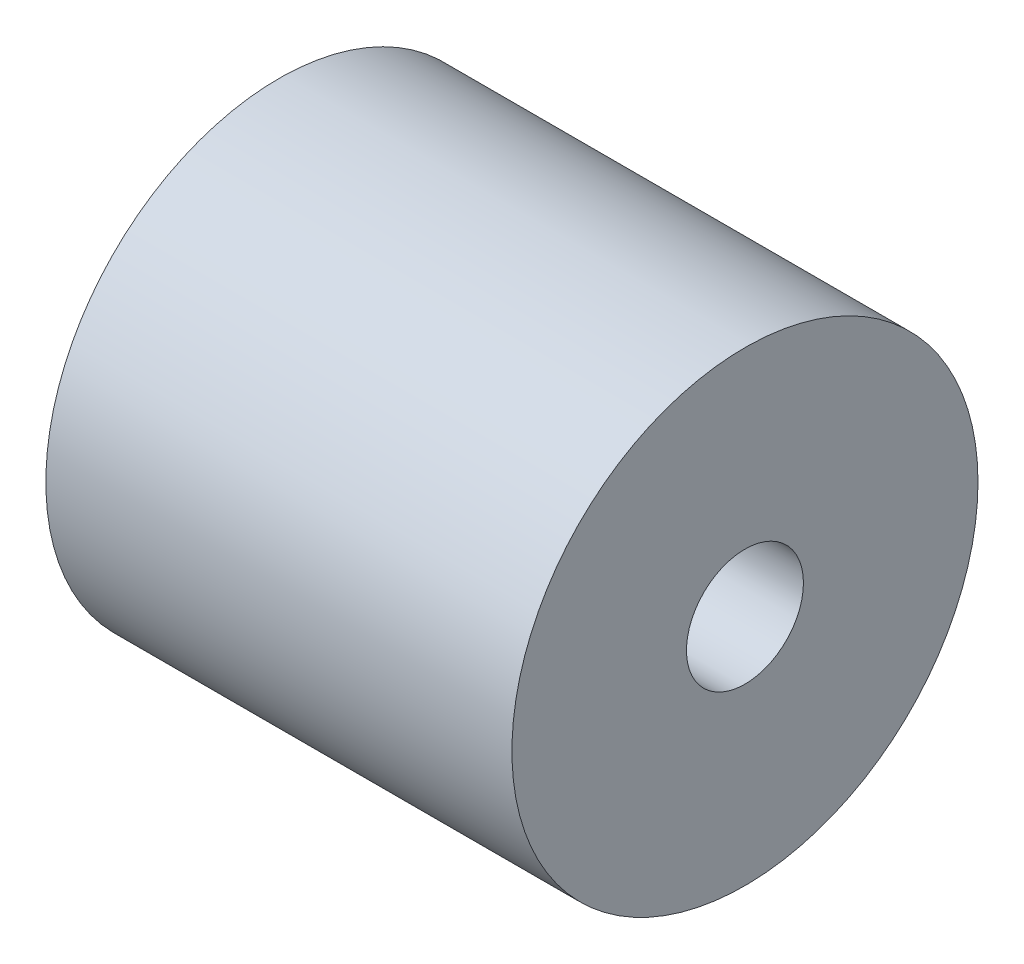
ISO-10303-21;
HEADER;
FILE_DESCRIPTION(('STEP AP214'),'2;1');
FILE_NAME('part.step','',(''),(''),'','','');
FILE_SCHEMA(('AUTOMOTIVE_DESIGN { 1 0 10303 214 1 1 1 1 }'));
ENDSEC;
DATA;
#1=APPLICATION_CONTEXT('core data for automotive mechanical design processes');
#2=APPLICATION_PROTOCOL_DEFINITION('international standard','automotive_design',2000,#1);
#3=PRODUCT_CONTEXT('',#1,'mechanical');
#4=PRODUCT('Part','Part','',(#3));
#5=PRODUCT_RELATED_PRODUCT_CATEGORY('part','',(#4));
#6=PRODUCT_DEFINITION_FORMATION('','',#4);
#7=PRODUCT_DEFINITION_CONTEXT('part definition',#1,'design');
#8=PRODUCT_DEFINITION('design','',#6,#7);
#9=PRODUCT_DEFINITION_SHAPE('','',#8);
#10=(LENGTH_UNIT() NAMED_UNIT(*) SI_UNIT(.MILLI.,.METRE.));
#11=(NAMED_UNIT(*) PLANE_ANGLE_UNIT() SI_UNIT($,.RADIAN.));
#12=(NAMED_UNIT(*) SI_UNIT($,.STERADIAN.) SOLID_ANGLE_UNIT());
#13=UNCERTAINTY_MEASURE_WITH_UNIT(LENGTH_MEASURE(1.E-05),#10,'distance_accuracy_value','');
#14=(GEOMETRIC_REPRESENTATION_CONTEXT(3) GLOBAL_UNCERTAINTY_ASSIGNED_CONTEXT((#13)) GLOBAL_UNIT_ASSIGNED_CONTEXT((#10,
#11,#12)) REPRESENTATION_CONTEXT('',''));
#15=CARTESIAN_POINT('',(0.,0.,0.));
#16=DIRECTION('',(0.,0.,1.));
#17=DIRECTION('',(1.,0.,0.));
#18=AXIS2_PLACEMENT_3D('',#15,#16,#17);
#19=CARTESIAN_POINT('',(203.2,0.,0.));
#20=DIRECTION('',(1.,0.,0.));
#21=DIRECTION('',(0.,0.,-1.));
#22=AXIS2_PLACEMENT_3D('',#19,#20,#21);
#23=PLANE('',#22);
#24=CARTESIAN_POINT('',(203.2,0.,0.));
#25=DIRECTION('',(1.,0.,0.));
#26=DIRECTION('',(0.,0.,-1.));
#27=AXIS2_PLACEMENT_3D('',#24,#25,#26);
#28=CIRCLE('',#27,101.6);
#29=CARTESIAN_POINT('',(203.2,0.,-101.6));
#30=VERTEX_POINT('',#29);
#31=EDGE_CURVE('E10',#30,#30,#28,.T.);
#32=ORIENTED_EDGE('',*,*,#31,.T.);
#33=EDGE_LOOP('',(#32));
#34=FACE_BOUND('',#33,.T.);
#35=CARTESIAN_POINT('',(203.2,0.,0.));
#36=DIRECTION('',(1.,0.,0.));
#37=DIRECTION('',(0.,0.,-1.));
#38=AXIS2_PLACEMENT_3D('',#35,#36,#37);
#39=CIRCLE('',#38,25.5);
#40=CARTESIAN_POINT('',(203.2,0.,-25.5));
#41=VERTEX_POINT('',#40);
#42=EDGE_CURVE('E39',#41,#41,#39,.T.);
#43=ORIENTED_EDGE('',*,*,#42,.F.);
#44=EDGE_LOOP('',(#43));
#45=FACE_BOUND('',#44,.T.);
#46=ADVANCED_FACE('F28',(#34,#45),#23,.T.);
#47=CARTESIAN_POINT('',(0.,0.,0.));
#48=DIRECTION('',(1.,0.,0.));
#49=DIRECTION('',(0.,0.,-1.));
#50=AXIS2_PLACEMENT_3D('',#47,#48,#49);
#51=PLANE('',#50);
#52=CARTESIAN_POINT('',(0.,0.,0.));
#53=DIRECTION('',(1.,0.,0.));
#54=DIRECTION('',(0.,0.,-1.));
#55=AXIS2_PLACEMENT_3D('',#52,#53,#54);
#56=CIRCLE('',#55,101.6);
#57=CARTESIAN_POINT('',(0.,0.,-101.6));
#58=VERTEX_POINT('',#57);
#59=EDGE_CURVE('E32',#58,#58,#56,.T.);
#60=ORIENTED_EDGE('',*,*,#59,.F.);
#61=EDGE_LOOP('',(#60));
#62=FACE_BOUND('',#61,.T.);
#63=CARTESIAN_POINT('',(0.,0.,0.));
#64=DIRECTION('',(1.,0.,0.));
#65=DIRECTION('',(0.,0.,-1.));
#66=AXIS2_PLACEMENT_3D('',#63,#64,#65);
#67=CIRCLE('',#66,25.5);
#68=CARTESIAN_POINT('',(0.,0.,-25.5));
#69=VERTEX_POINT('',#68);
#70=EDGE_CURVE('E41',#69,#69,#67,.T.);
#71=ORIENTED_EDGE('',*,*,#70,.T.);
#72=EDGE_LOOP('',(#71));
#73=FACE_BOUND('',#72,.T.);
#74=ADVANCED_FACE('F51',(#62,#73),#51,.F.);
#75=CARTESIAN_POINT('',(203.2,0.,0.));
#76=DIRECTION('',(-1.,0.,0.));
#77=DIRECTION('',(0.,0.,1.));
#78=AXIS2_PLACEMENT_3D('',#75,#76,#77);
#79=CYLINDRICAL_SURFACE('',#78,101.6);
#80=ORIENTED_EDGE('',*,*,#31,.F.);
#81=EDGE_LOOP('',(#80));
#82=FACE_BOUND('',#81,.T.);
#83=ORIENTED_EDGE('',*,*,#59,.T.);
#84=EDGE_LOOP('',(#83));
#85=FACE_BOUND('',#84,.T.);
#86=ADVANCED_FACE('F30',(#82,#85),#79,.T.);
#87=CARTESIAN_POINT('',(203.2,0.,0.));
#88=DIRECTION('',(-1.,0.,0.));
#89=DIRECTION('',(0.,0.,1.));
#90=AXIS2_PLACEMENT_3D('',#87,#88,#89);
#91=CYLINDRICAL_SURFACE('',#90,25.5);
#92=ORIENTED_EDGE('',*,*,#42,.T.);
#93=EDGE_LOOP('',(#92));
#94=FACE_BOUND('',#93,.T.);
#95=ORIENTED_EDGE('',*,*,#70,.F.);
#96=EDGE_LOOP('',(#95));
#97=FACE_BOUND('',#96,.T.);
#98=ADVANCED_FACE('F47',(#94,#97),#91,.F.);
#99=CLOSED_SHELL('',(#46,#74,#86,#98));
#100=MANIFOLD_SOLID_BREP('B2',#99);
#101=ADVANCED_BREP_SHAPE_REPRESENTATION('',(#18,#100),#14);
#102=SHAPE_DEFINITION_REPRESENTATION(#9,#101);
ENDSEC;
END-ISO-10303-21;
